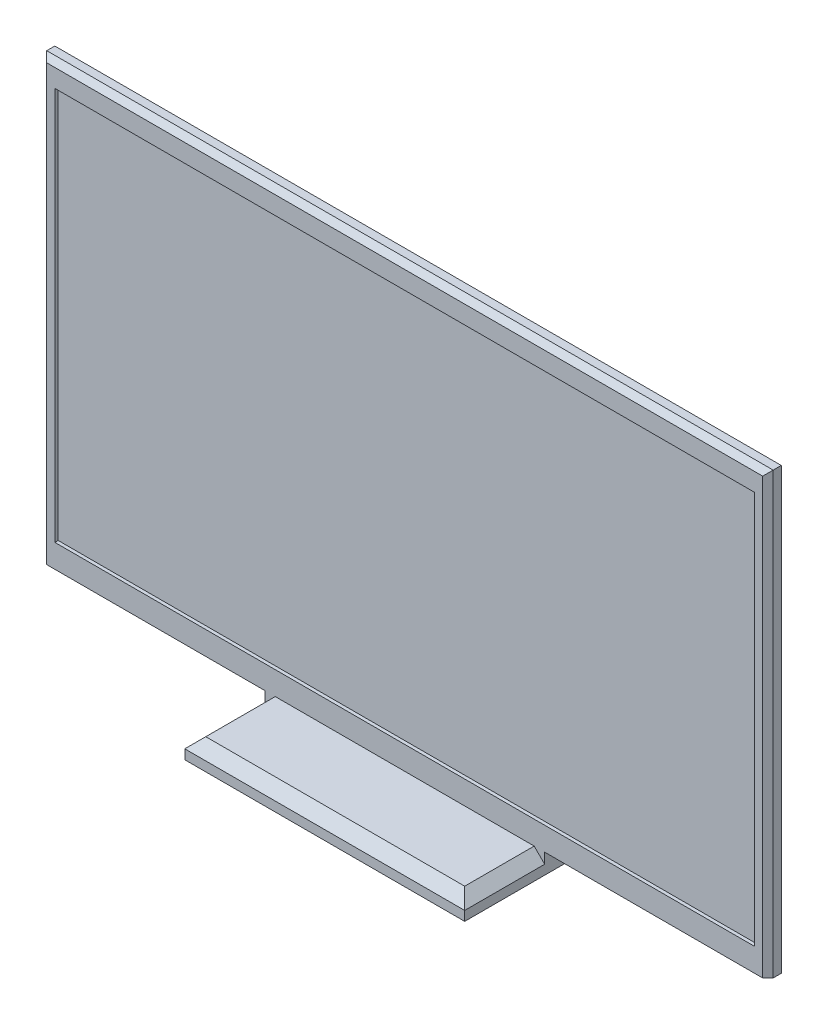
ISO-10303-21;
HEADER;
FILE_DESCRIPTION(('STEP AP214'),'2;1');
FILE_NAME('part.step','',(''),(''),'','','');
FILE_SCHEMA(('AUTOMOTIVE_DESIGN { 1 0 10303 214 1 1 1 1 }'));
ENDSEC;
DATA;
#1=APPLICATION_CONTEXT('core data for automotive mechanical design processes');
#2=APPLICATION_PROTOCOL_DEFINITION('international standard','automotive_design',2000,#1);
#3=PRODUCT_CONTEXT('',#1,'mechanical');
#4=PRODUCT('Part','Part','',(#3));
#5=PRODUCT_RELATED_PRODUCT_CATEGORY('part','',(#4));
#6=PRODUCT_DEFINITION_FORMATION('','',#4);
#7=PRODUCT_DEFINITION_CONTEXT('part definition',#1,'design');
#8=PRODUCT_DEFINITION('design','',#6,#7);
#9=PRODUCT_DEFINITION_SHAPE('','',#8);
#10=(LENGTH_UNIT() NAMED_UNIT(*) SI_UNIT(.MILLI.,.METRE.));
#11=(NAMED_UNIT(*) PLANE_ANGLE_UNIT() SI_UNIT($,.RADIAN.));
#12=(NAMED_UNIT(*) SI_UNIT($,.STERADIAN.) SOLID_ANGLE_UNIT());
#13=UNCERTAINTY_MEASURE_WITH_UNIT(LENGTH_MEASURE(1.E-05),#10,'distance_accuracy_value','');
#14=(GEOMETRIC_REPRESENTATION_CONTEXT(3) GLOBAL_UNCERTAINTY_ASSIGNED_CONTEXT((#13)) GLOBAL_UNIT_ASSIGNED_CONTEXT((#10,
#11,#12)) REPRESENTATION_CONTEXT('',''));
#15=CARTESIAN_POINT('',(0.,0.,0.));
#16=DIRECTION('',(0.,0.,1.));
#17=DIRECTION('',(1.,0.,0.));
#18=AXIS2_PLACEMENT_3D('',#15,#16,#17);
#19=CARTESIAN_POINT('',(-692.15,-419.1,25.4000000000003));
#20=DIRECTION('',(0.,1.,0.));
#21=DIRECTION('',(0.,0.,1.));
#22=AXIS2_PLACEMENT_3D('',#19,#20,#21);
#23=PLANE('',#22);
#24=DIRECTION('',(0.,0.,-1.));
#25=VECTOR('',#24,1.);
#26=CARTESIAN_POINT('',(-266.699999999999,-419.1,-152.4));
#27=LINE('',#26,#25);
#28=CARTESIAN_POINT('',(-266.7,-419.1,25.4000000000003));
#29=VERTEX_POINT('',#28);
#30=CARTESIAN_POINT('',(-266.7,-419.1,0.));
#31=VERTEX_POINT('',#30);
#32=EDGE_CURVE('E289',#29,#31,#27,.T.);
#33=ORIENTED_EDGE('',*,*,#32,.F.);
#34=DIRECTION('',(1.,0.,0.));
#35=VECTOR('',#34,1.);
#36=CARTESIAN_POINT('',(-692.15,-419.1,25.4000000000003));
#37=LINE('',#36,#35);
#38=CARTESIAN_POINT('',(-682.15,-419.1,25.3999999999994));
#39=VERTEX_POINT('',#38);
#40=EDGE_CURVE('E231',#39,#29,#37,.T.);
#41=ORIENTED_EDGE('',*,*,#40,.F.);
#42=DIRECTION('',(0.707106781186547,0.,0.707106781186547));
#43=VECTOR('',#42,1.);
#44=CARTESIAN_POINT('',(-682.15,-419.1,25.3999999999994));
#45=LINE('',#44,#43);
#46=CARTESIAN_POINT('',(-692.15,-419.1,15.4000000000005));
#47=VERTEX_POINT('',#46);
#48=EDGE_CURVE('E273',#39,#47,#45,.F.);
#49=ORIENTED_EDGE('',*,*,#48,.T.);
#50=DIRECTION('',(0.,0.,-1.));
#51=VECTOR('',#50,1.);
#52=CARTESIAN_POINT('',(-692.15,-419.1,25.4000000000003));
#53=LINE('',#52,#51);
#54=CARTESIAN_POINT('',(-692.15,-419.1,0.));
#55=VERTEX_POINT('',#54);
#56=EDGE_CURVE('E253',#47,#55,#53,.T.);
#57=ORIENTED_EDGE('',*,*,#56,.T.);
#58=DIRECTION('',(1.,0.,0.));
#59=VECTOR('',#58,1.);
#60=CARTESIAN_POINT('',(-692.15,-419.1,0.));
#61=LINE('',#60,#59);
#62=EDGE_CURVE('E247',#55,#31,#61,.T.);
#63=ORIENTED_EDGE('',*,*,#62,.T.);
#64=EDGE_LOOP('',(#33,#41,#49,#57,#63));
#65=FACE_BOUND('',#64,.T.);
#66=ADVANCED_FACE('F36',(#65),#23,.F.);
#67=DIRECTION('',(0.,0.,1.));
#68=VECTOR('',#67,1.);
#69=CARTESIAN_POINT('',(266.7,-419.1,-152.4));
#70=LINE('',#69,#68);
#71=CARTESIAN_POINT('',(266.7,-419.1,0.));
#72=VERTEX_POINT('',#71);
#73=CARTESIAN_POINT('',(266.7,-419.1,25.3999999999994));
#74=VERTEX_POINT('',#73);
#75=EDGE_CURVE('E284',#72,#74,#70,.T.);
#76=ORIENTED_EDGE('',*,*,#75,.F.);
#77=CARTESIAN_POINT('',(692.15,-419.1,0.));
#78=VERTEX_POINT('',#77);
#79=EDGE_CURVE('E246',#72,#78,#61,.T.);
#80=ORIENTED_EDGE('',*,*,#79,.T.);
#81=DIRECTION('',(0.,0.,-1.));
#82=VECTOR('',#81,1.);
#83=CARTESIAN_POINT('',(692.15,-419.1,25.4000000000003));
#84=LINE('',#83,#82);
#85=CARTESIAN_POINT('',(692.15,-419.1,15.3999999999996));
#86=VERTEX_POINT('',#85);
#87=EDGE_CURVE('E234',#86,#78,#84,.T.);
#88=ORIENTED_EDGE('',*,*,#87,.F.);
#89=DIRECTION('',(0.707106781186547,0.,-0.707106781186547));
#90=VECTOR('',#89,1.);
#91=CARTESIAN_POINT('',(682.15,-419.1,25.4000000000003));
#92=LINE('',#91,#90);
#93=CARTESIAN_POINT('',(682.149999999999,-419.1,25.4000000000003));
#94=VERTEX_POINT('',#93);
#95=EDGE_CURVE('E270',#86,#94,#92,.F.);
#96=ORIENTED_EDGE('',*,*,#95,.T.);
#97=EDGE_CURVE('E236',#74,#94,#37,.T.);
#98=ORIENTED_EDGE('',*,*,#97,.F.);
#99=EDGE_LOOP('',(#76,#80,#88,#96,#98));
#100=FACE_BOUND('',#99,.T.);
#101=ADVANCED_FACE('F334',(#100),#23,.F.);
#102=CARTESIAN_POINT('',(692.15,-419.1,25.4000000000003));
#103=DIRECTION('',(-1.,0.,0.));
#104=DIRECTION('',(0.,0.,1.));
#105=AXIS2_PLACEMENT_3D('',#102,#103,#104);
#106=PLANE('',#105);
#107=DIRECTION('',(0.,0.,-1.));
#108=VECTOR('',#107,1.);
#109=CARTESIAN_POINT('',(692.150000000001,419.1,25.4000000000003));
#110=LINE('',#109,#108);
#111=CARTESIAN_POINT('',(692.150000000001,419.1,15.4000000000005));
#112=VERTEX_POINT('',#111);
#113=CARTESIAN_POINT('',(692.150000000001,419.1,8.88178419700125E-13));
#114=VERTEX_POINT('',#113);
#115=EDGE_CURVE('E259',#112,#114,#110,.T.);
#116=ORIENTED_EDGE('',*,*,#115,.F.);
#117=DIRECTION('',(0.,-1.,0.));
#118=VECTOR('',#117,1.);
#119=CARTESIAN_POINT('',(692.15,-419.1,15.3999999999996));
#120=LINE('',#119,#118);
#121=EDGE_CURVE('E279',#112,#86,#120,.T.);
#122=ORIENTED_EDGE('',*,*,#121,.T.);
#123=ORIENTED_EDGE('',*,*,#87,.T.);
#124=DIRECTION('',(0.,1.,0.));
#125=VECTOR('',#124,1.);
#126=CARTESIAN_POINT('',(692.15,-419.1,0.));
#127=LINE('',#126,#125);
#128=EDGE_CURVE('E237',#78,#114,#127,.T.);
#129=ORIENTED_EDGE('',*,*,#128,.T.);
#130=EDGE_LOOP('',(#116,#122,#123,#129));
#131=FACE_BOUND('',#130,.T.);
#132=ADVANCED_FACE('F371',(#131),#106,.F.);
#133=CARTESIAN_POINT('',(-692.149999999999,419.1,25.3999999999994));
#134=DIRECTION('',(0.,-1.,0.));
#135=DIRECTION('',(0.,0.,-1.));
#136=AXIS2_PLACEMENT_3D('',#133,#134,#135);
#137=PLANE('',#136);
#138=DIRECTION('',(0.,0.,-1.));
#139=VECTOR('',#138,1.);
#140=CARTESIAN_POINT('',(-692.149999999999,419.1,25.3999999999994));
#141=LINE('',#140,#139);
#142=CARTESIAN_POINT('',(-692.149999999999,419.1,15.3999999999996));
#143=VERTEX_POINT('',#142);
#144=CARTESIAN_POINT('',(-692.149999999999,419.1,0.));
#145=VERTEX_POINT('',#144);
#146=EDGE_CURVE('E256',#143,#145,#141,.T.);
#147=ORIENTED_EDGE('',*,*,#146,.F.);
#148=DIRECTION('',(1.,0.,0.));
#149=VECTOR('',#148,1.);
#150=CARTESIAN_POINT('',(-692.149999999999,419.1,15.3999999999996));
#151=LINE('',#150,#149);
#152=EDGE_CURVE('E281',#143,#112,#151,.T.);
#153=ORIENTED_EDGE('',*,*,#152,.T.);
#154=ORIENTED_EDGE('',*,*,#115,.T.);
#155=DIRECTION('',(-1.,0.,0.));
#156=VECTOR('',#155,1.);
#157=CARTESIAN_POINT('',(-692.149999999999,419.1,0.));
#158=LINE('',#157,#156);
#159=EDGE_CURVE('E240',#114,#145,#158,.T.);
#160=ORIENTED_EDGE('',*,*,#159,.T.);
#161=EDGE_LOOP('',(#147,#153,#154,#160));
#162=FACE_BOUND('',#161,.T.);
#163=ADVANCED_FACE('F359',(#162),#137,.F.);
#164=CARTESIAN_POINT('',(-692.15,-419.1,25.4000000000003));
#165=DIRECTION('',(1.,0.,0.));
#166=DIRECTION('',(0.,0.,-1.));
#167=AXIS2_PLACEMENT_3D('',#164,#165,#166);
#168=PLANE('',#167);
#169=ORIENTED_EDGE('',*,*,#56,.F.);
#170=DIRECTION('',(0.,1.,0.));
#171=VECTOR('',#170,1.);
#172=CARTESIAN_POINT('',(-692.15,-419.1,15.4000000000005));
#173=LINE('',#172,#171);
#174=EDGE_CURVE('E276',#47,#143,#173,.T.);
#175=ORIENTED_EDGE('',*,*,#174,.T.);
#176=ORIENTED_EDGE('',*,*,#146,.T.);
#177=DIRECTION('',(0.,-1.,0.));
#178=VECTOR('',#177,1.);
#179=CARTESIAN_POINT('',(-692.15,-419.1,0.));
#180=LINE('',#179,#178);
#181=EDGE_CURVE('E244',#145,#55,#180,.T.);
#182=ORIENTED_EDGE('',*,*,#181,.T.);
#183=EDGE_LOOP('',(#169,#175,#176,#182));
#184=FACE_BOUND('',#183,.T.);
#185=ADVANCED_FACE('F361',(#184),#168,.F.);
#186=CARTESIAN_POINT('',(0.,0.,25.4000000000003));
#187=DIRECTION('',(0.,0.,-1.));
#188=DIRECTION('',(-1.,0.,0.));
#189=AXIS2_PLACEMENT_3D('',#186,#187,#188);
#190=PLANE('',#189);
#191=DIRECTION('',(-1.,0.,0.));
#192=VECTOR('',#191,1.);
#193=CARTESIAN_POINT('',(-666.75,374.65,25.4000000000003));
#194=LINE('',#193,#192);
#195=CARTESIAN_POINT('',(666.75,374.65,25.4000000000003));
#196=VERTEX_POINT('',#195);
#197=CARTESIAN_POINT('',(-666.75,374.65,25.4000000000003));
#198=VERTEX_POINT('',#197);
#199=EDGE_CURVE('E199',#196,#198,#194,.T.);
#200=ORIENTED_EDGE('',*,*,#199,.F.);
#201=DIRECTION('',(0.,1.,0.));
#202=VECTOR('',#201,1.);
#203=CARTESIAN_POINT('',(666.75,-374.65,25.4000000000003));
#204=LINE('',#203,#202);
#205=CARTESIAN_POINT('',(666.75,-374.65,25.4000000000003));
#206=VERTEX_POINT('',#205);
#207=EDGE_CURVE('E196',#206,#196,#204,.T.);
#208=ORIENTED_EDGE('',*,*,#207,.F.);
#209=DIRECTION('',(1.,0.,0.));
#210=VECTOR('',#209,1.);
#211=CARTESIAN_POINT('',(-666.75,-374.65,25.3999999999994));
#212=LINE('',#211,#210);
#213=CARTESIAN_POINT('',(-666.75,-374.65,25.3999999999994));
#214=VERTEX_POINT('',#213);
#215=EDGE_CURVE('E209',#214,#206,#212,.T.);
#216=ORIENTED_EDGE('',*,*,#215,.F.);
#217=DIRECTION('',(0.,-1.,0.));
#218=VECTOR('',#217,1.);
#219=CARTESIAN_POINT('',(-666.75,-374.65,25.3999999999994));
#220=LINE('',#219,#218);
#221=EDGE_CURVE('E218',#198,#214,#220,.T.);
#222=ORIENTED_EDGE('',*,*,#221,.F.);
#223=EDGE_LOOP('',(#200,#208,#216,#222));
#224=FACE_BOUND('',#223,.T.);
#225=DIRECTION('',(-1.,0.,0.));
#226=VECTOR('',#225,1.);
#227=CARTESIAN_POINT('',(8.88178419700125E-13,409.1,25.4000000000003));
#228=LINE('',#227,#226);
#229=CARTESIAN_POINT('',(682.15,409.1,25.4000000000003));
#230=VERTEX_POINT('',#229);
#231=CARTESIAN_POINT('',(-682.149999999999,409.1,25.4000000000003));
#232=VERTEX_POINT('',#231);
#233=EDGE_CURVE('E262',#230,#232,#228,.T.);
#234=ORIENTED_EDGE('',*,*,#233,.T.);
#235=DIRECTION('',(0.,-1.,0.));
#236=VECTOR('',#235,1.);
#237=CARTESIAN_POINT('',(-682.15,0.,25.4000000000003));
#238=LINE('',#237,#236);
#239=EDGE_CURVE('E268',#232,#39,#238,.T.);
#240=ORIENTED_EDGE('',*,*,#239,.T.);
#241=ORIENTED_EDGE('',*,*,#40,.T.);
#242=DIRECTION('',(0.,1.,0.));
#243=VECTOR('',#242,1.);
#244=CARTESIAN_POINT('',(-266.7,-457.2,25.4000000000003));
#245=LINE('',#244,#243);
#246=CARTESIAN_POINT('',(-266.7,-439.1,25.4000000000003));
#247=VERTEX_POINT('',#246);
#248=EDGE_CURVE('E300',#247,#29,#245,.T.);
#249=ORIENTED_EDGE('',*,*,#248,.F.);
#250=DIRECTION('',(0.707106781186547,0.707106781186548,0.));
#251=VECTOR('',#250,1.);
#252=CARTESIAN_POINT('',(86.1999999999998,-86.1999999999996,25.3999999999994));
#253=LINE('',#252,#251);
#254=CARTESIAN_POINT('',(-246.700000000001,-419.1,25.4000000000003));
#255=VERTEX_POINT('',#254);
#256=EDGE_CURVE('E11',#247,#255,#253,.T.);
#257=ORIENTED_EDGE('',*,*,#256,.T.);
#258=CARTESIAN_POINT('',(246.700000000001,-419.1,25.4000000000003));
#259=VERTEX_POINT('',#258);
#260=EDGE_CURVE('E235',#255,#259,#37,.T.);
#261=ORIENTED_EDGE('',*,*,#260,.T.);
#262=DIRECTION('',(0.707106781186547,-0.707106781186547,0.));
#263=VECTOR('',#262,1.);
#264=CARTESIAN_POINT('',(-86.1999999999998,-86.1999999999999,25.4000000000003));
#265=LINE('',#264,#263);
#266=CARTESIAN_POINT('',(266.7,-439.1,25.3999999999994));
#267=VERTEX_POINT('',#266);
#268=EDGE_CURVE('E45',#259,#267,#265,.T.);
#269=ORIENTED_EDGE('',*,*,#268,.T.);
#270=DIRECTION('',(0.,-1.,0.));
#271=VECTOR('',#270,1.);
#272=CARTESIAN_POINT('',(266.7,-457.2,25.3999999999994));
#273=LINE('',#272,#271);
#274=EDGE_CURVE('E53',#74,#267,#273,.T.);
#275=ORIENTED_EDGE('',*,*,#274,.F.);
#276=ORIENTED_EDGE('',*,*,#97,.T.);
#277=DIRECTION('',(0.,1.,0.));
#278=VECTOR('',#277,1.);
#279=CARTESIAN_POINT('',(682.149999999999,0.,25.3999999999994));
#280=LINE('',#279,#278);
#281=EDGE_CURVE('E265',#94,#230,#280,.T.);
#282=ORIENTED_EDGE('',*,*,#281,.T.);
#283=EDGE_LOOP('',(#234,#240,#241,#249,#257,#261,#269,#275,#276,#282));
#284=FACE_BOUND('',#283,.T.);
#285=ADVANCED_FACE('F338',(#224,#284),#190,.F.);
#286=CARTESIAN_POINT('',(0.,0.,0.));
#287=DIRECTION('',(0.,0.,-1.));
#288=DIRECTION('',(-1.,0.,0.));
#289=AXIS2_PLACEMENT_3D('',#286,#287,#288);
#290=PLANE('',#289);
#291=ORIENTED_EDGE('',*,*,#128,.F.);
#292=ORIENTED_EDGE('',*,*,#79,.F.);
#293=EDGE_CURVE('E250',#31,#72,#61,.T.);
#294=ORIENTED_EDGE('',*,*,#293,.F.);
#295=ORIENTED_EDGE('',*,*,#62,.F.);
#296=ORIENTED_EDGE('',*,*,#181,.F.);
#297=ORIENTED_EDGE('',*,*,#159,.F.);
#298=EDGE_LOOP('',(#291,#292,#294,#295,#296,#297));
#299=FACE_BOUND('',#298,.T.);
#300=ADVANCED_FACE('F331',(#299),#290,.T.);
#301=CARTESIAN_POINT('',(682.149999999999,0.,25.3999999999994));
#302=DIRECTION('',(-0.707106781186547,0.,-0.707106781186547));
#303=DIRECTION('',(0.,1.,0.));
#304=AXIS2_PLACEMENT_3D('',#301,#302,#303);
#305=PLANE('',#304);
#306=ORIENTED_EDGE('',*,*,#95,.F.);
#307=ORIENTED_EDGE('',*,*,#121,.F.);
#308=DIRECTION('',(0.577350269189626,0.577350269189626,-0.577350269189625));
#309=VECTOR('',#308,1.);
#310=CARTESIAN_POINT('',(454.766666666666,181.716666666667,252.783333333333));
#311=LINE('',#310,#309);
#312=EDGE_CURVE('E241',#230,#112,#311,.T.);
#313=ORIENTED_EDGE('',*,*,#312,.F.);
#314=ORIENTED_EDGE('',*,*,#281,.F.);
#315=EDGE_LOOP('',(#306,#307,#313,#314));
#316=FACE_BOUND('',#315,.T.);
#317=ADVANCED_FACE('F369',(#316),#305,.F.);
#318=CARTESIAN_POINT('',(8.88178419700125E-13,409.1,25.4000000000003));
#319=DIRECTION('',(0.,-0.707106781186548,-0.707106781186547));
#320=DIRECTION('',(-1.,0.,0.));
#321=AXIS2_PLACEMENT_3D('',#318,#319,#320);
#322=PLANE('',#321);
#323=ORIENTED_EDGE('',*,*,#312,.T.);
#324=ORIENTED_EDGE('',*,*,#152,.F.);
#325=DIRECTION('',(0.577350269189626,-0.577350269189626,0.577350269189625));
#326=VECTOR('',#325,1.);
#327=CARTESIAN_POINT('',(-454.766666666666,181.716666666667,252.783333333333));
#328=LINE('',#327,#326);
#329=EDGE_CURVE('E225',#232,#143,#328,.F.);
#330=ORIENTED_EDGE('',*,*,#329,.F.);
#331=ORIENTED_EDGE('',*,*,#233,.F.);
#332=EDGE_LOOP('',(#323,#324,#330,#331));
#333=FACE_BOUND('',#332,.T.);
#334=ADVANCED_FACE('F365',(#333),#322,.F.);
#335=CARTESIAN_POINT('',(-682.15,0.,25.4000000000003));
#336=DIRECTION('',(0.707106781186547,0.,-0.707106781186547));
#337=DIRECTION('',(0.,-1.,0.));
#338=AXIS2_PLACEMENT_3D('',#335,#336,#337);
#339=PLANE('',#338);
#340=ORIENTED_EDGE('',*,*,#329,.T.);
#341=ORIENTED_EDGE('',*,*,#174,.F.);
#342=ORIENTED_EDGE('',*,*,#48,.F.);
#343=ORIENTED_EDGE('',*,*,#239,.F.);
#344=EDGE_LOOP('',(#340,#341,#342,#343));
#345=FACE_BOUND('',#344,.T.);
#346=ADVANCED_FACE('F401',(#345),#339,.F.);
#347=CARTESIAN_POINT('',(666.75,-374.65,19.05));
#348=DIRECTION('',(1.,0.,0.));
#349=DIRECTION('',(0.,0.,-1.));
#350=AXIS2_PLACEMENT_3D('',#347,#348,#349);
#351=PLANE('',#350);
#352=ORIENTED_EDGE('',*,*,#207,.T.);
#353=DIRECTION('',(0.,0.,1.));
#354=VECTOR('',#353,1.);
#355=CARTESIAN_POINT('',(666.75,374.65,19.05));
#356=LINE('',#355,#354);
#357=CARTESIAN_POINT('',(666.75,374.65,19.05));
#358=VERTEX_POINT('',#357);
#359=EDGE_CURVE('E214',#358,#196,#356,.T.);
#360=ORIENTED_EDGE('',*,*,#359,.F.);
#361=DIRECTION('',(0.,1.,0.));
#362=VECTOR('',#361,1.);
#363=CARTESIAN_POINT('',(666.75,-374.65,19.05));
#364=LINE('',#363,#362);
#365=CARTESIAN_POINT('',(666.75,-374.65,19.05));
#366=VERTEX_POINT('',#365);
#367=EDGE_CURVE('E205',#366,#358,#364,.T.);
#368=ORIENTED_EDGE('',*,*,#367,.F.);
#369=DIRECTION('',(0.,0.,1.));
#370=VECTOR('',#369,1.);
#371=CARTESIAN_POINT('',(666.75,-374.65,19.05));
#372=LINE('',#371,#370);
#373=EDGE_CURVE('E223',#366,#206,#372,.T.);
#374=ORIENTED_EDGE('',*,*,#373,.T.);
#375=EDGE_LOOP('',(#352,#360,#368,#374));
#376=FACE_BOUND('',#375,.T.);
#377=ADVANCED_FACE('F397',(#376),#351,.F.);
#378=CARTESIAN_POINT('',(-666.75,-374.65,19.05));
#379=DIRECTION('',(0.,-1.,0.));
#380=DIRECTION('',(0.,0.,-1.));
#381=AXIS2_PLACEMENT_3D('',#378,#379,#380);
#382=PLANE('',#381);
#383=ORIENTED_EDGE('',*,*,#215,.T.);
#384=ORIENTED_EDGE('',*,*,#373,.F.);
#385=DIRECTION('',(1.,0.,0.));
#386=VECTOR('',#385,1.);
#387=CARTESIAN_POINT('',(-666.75,-374.65,19.05));
#388=LINE('',#387,#386);
#389=CARTESIAN_POINT('',(-666.75,-374.65,19.05));
#390=VERTEX_POINT('',#389);
#391=EDGE_CURVE('E213',#390,#366,#388,.T.);
#392=ORIENTED_EDGE('',*,*,#391,.F.);
#393=DIRECTION('',(0.,0.,1.));
#394=VECTOR('',#393,1.);
#395=CARTESIAN_POINT('',(-666.75,-374.65,19.05));
#396=LINE('',#395,#394);
#397=EDGE_CURVE('E226',#390,#214,#396,.T.);
#398=ORIENTED_EDGE('',*,*,#397,.T.);
#399=EDGE_LOOP('',(#383,#384,#392,#398));
#400=FACE_BOUND('',#399,.T.);
#401=ADVANCED_FACE('F400',(#400),#382,.F.);
#402=CARTESIAN_POINT('',(-666.75,-374.65,19.05));
#403=DIRECTION('',(-1.,0.,0.));
#404=DIRECTION('',(0.,0.,1.));
#405=AXIS2_PLACEMENT_3D('',#402,#403,#404);
#406=PLANE('',#405);
#407=ORIENTED_EDGE('',*,*,#221,.T.);
#408=ORIENTED_EDGE('',*,*,#397,.F.);
#409=DIRECTION('',(0.,-1.,0.));
#410=VECTOR('',#409,1.);
#411=CARTESIAN_POINT('',(-666.75,-374.65,19.05));
#412=LINE('',#411,#410);
#413=CARTESIAN_POINT('',(-666.749999999999,374.65,19.05));
#414=VERTEX_POINT('',#413);
#415=EDGE_CURVE('E211',#414,#390,#412,.T.);
#416=ORIENTED_EDGE('',*,*,#415,.F.);
#417=DIRECTION('',(0.,0.,1.));
#418=VECTOR('',#417,1.);
#419=CARTESIAN_POINT('',(-666.749999999999,374.65,19.05));
#420=LINE('',#419,#418);
#421=EDGE_CURVE('E228',#414,#198,#420,.T.);
#422=ORIENTED_EDGE('',*,*,#421,.T.);
#423=EDGE_LOOP('',(#407,#408,#416,#422));
#424=FACE_BOUND('',#423,.T.);
#425=ADVANCED_FACE('F407',(#424),#406,.F.);
#426=CARTESIAN_POINT('',(-666.749999999999,374.65,19.05));
#427=DIRECTION('',(0.,1.,0.));
#428=DIRECTION('',(0.,0.,1.));
#429=AXIS2_PLACEMENT_3D('',#426,#427,#428);
#430=PLANE('',#429);
#431=ORIENTED_EDGE('',*,*,#199,.T.);
#432=ORIENTED_EDGE('',*,*,#421,.F.);
#433=DIRECTION('',(-1.,0.,0.));
#434=VECTOR('',#433,1.);
#435=CARTESIAN_POINT('',(-666.749999999999,374.65,19.05));
#436=LINE('',#435,#434);
#437=EDGE_CURVE('E208',#358,#414,#436,.T.);
#438=ORIENTED_EDGE('',*,*,#437,.F.);
#439=ORIENTED_EDGE('',*,*,#359,.T.);
#440=EDGE_LOOP('',(#431,#432,#438,#439));
#441=FACE_BOUND('',#440,.T.);
#442=ADVANCED_FACE('F403',(#441),#430,.F.);
#443=CARTESIAN_POINT('',(0.,0.,19.05));
#444=DIRECTION('',(0.,0.,-1.));
#445=DIRECTION('',(-1.,0.,0.));
#446=AXIS2_PLACEMENT_3D('',#443,#444,#445);
#447=PLANE('',#446);
#448=ORIENTED_EDGE('',*,*,#367,.T.);
#449=ORIENTED_EDGE('',*,*,#437,.T.);
#450=ORIENTED_EDGE('',*,*,#415,.T.);
#451=ORIENTED_EDGE('',*,*,#391,.T.);
#452=EDGE_LOOP('',(#448,#449,#450,#451));
#453=FACE_BOUND('',#452,.T.);
#454=ADVANCED_FACE('F406',(#453),#447,.F.);
#455=CARTESIAN_POINT('',(0.,-419.1,0.));
#456=DIRECTION('',(0.,1.,0.));
#457=DIRECTION('',(0.,0.,1.));
#458=AXIS2_PLACEMENT_3D('',#455,#456,#457);
#459=PLANE('',#458);
#460=DIRECTION('',(1.,0.,0.));
#461=VECTOR('',#460,1.);
#462=CARTESIAN_POINT('',(266.700000000001,-419.1,157.8));
#463=LINE('',#462,#461);
#464=CARTESIAN_POINT('',(-246.7,-419.1,157.800000000001));
#465=VERTEX_POINT('',#464);
#466=CARTESIAN_POINT('',(246.700000000001,-419.1,157.800000000001));
#467=VERTEX_POINT('',#466);
#468=EDGE_CURVE('E292',#465,#467,#463,.T.);
#469=ORIENTED_EDGE('',*,*,#468,.T.);
#470=DIRECTION('',(0.,0.,-1.));
#471=VECTOR('',#470,1.);
#472=CARTESIAN_POINT('',(246.700000000001,-419.1,25.4000000000003));
#473=LINE('',#472,#471);
#474=EDGE_CURVE('E298',#467,#259,#473,.T.);
#475=ORIENTED_EDGE('',*,*,#474,.T.);
#476=ORIENTED_EDGE('',*,*,#260,.F.);
#477=DIRECTION('',(0.,0.,1.));
#478=VECTOR('',#477,1.);
#479=CARTESIAN_POINT('',(-246.7,-419.1,177.8));
#480=LINE('',#479,#478);
#481=EDGE_CURVE('E295',#255,#465,#480,.T.);
#482=ORIENTED_EDGE('',*,*,#481,.T.);
#483=EDGE_LOOP('',(#469,#475,#476,#482));
#484=FACE_BOUND('',#483,.T.);
#485=ADVANCED_FACE('F342',(#484),#459,.T.);
#486=CARTESIAN_POINT('',(-266.699999999999,-457.2,-152.4));
#487=DIRECTION('',(1.,0.,0.));
#488=DIRECTION('',(0.,0.,-1.));
#489=AXIS2_PLACEMENT_3D('',#486,#487,#488);
#490=PLANE('',#489);
#491=DIRECTION('',(0.,1.,0.));
#492=VECTOR('',#491,1.);
#493=CARTESIAN_POINT('',(-266.699999999999,-457.2,177.8));
#494=LINE('',#493,#492);
#495=CARTESIAN_POINT('',(-266.699999999999,-457.2,177.8));
#496=VERTEX_POINT('',#495);
#497=CARTESIAN_POINT('',(-266.699999999999,-439.1,177.8));
#498=VERTEX_POINT('',#497);
#499=EDGE_CURVE('E347',#496,#498,#494,.T.);
#500=ORIENTED_EDGE('',*,*,#499,.T.);
#501=DIRECTION('',(0.,0.,-1.));
#502=VECTOR('',#501,1.);
#503=CARTESIAN_POINT('',(-266.7,-439.1,25.4000000000003));
#504=LINE('',#503,#502);
#505=EDGE_CURVE('E61',#498,#247,#504,.T.);
#506=ORIENTED_EDGE('',*,*,#505,.T.);
#507=ORIENTED_EDGE('',*,*,#248,.T.);
#508=ORIENTED_EDGE('',*,*,#32,.T.);
#509=CARTESIAN_POINT('',(-266.699999999999,-419.1,-152.4));
#510=VERTEX_POINT('',#509);
#511=EDGE_CURVE('E195',#31,#510,#27,.T.);
#512=ORIENTED_EDGE('',*,*,#511,.T.);
#513=DIRECTION('',(0.,1.,0.));
#514=VECTOR('',#513,1.);
#515=CARTESIAN_POINT('',(-266.699999999999,-457.2,-152.4));
#516=LINE('',#515,#514);
#517=CARTESIAN_POINT('',(-266.699999999999,-457.2,-152.4));
#518=VERTEX_POINT('',#517);
#519=EDGE_CURVE('E178',#518,#510,#516,.T.);
#520=ORIENTED_EDGE('',*,*,#519,.F.);
#521=DIRECTION('',(0.,0.,-1.));
#522=VECTOR('',#521,1.);
#523=CARTESIAN_POINT('',(-266.699999999999,-457.2,-152.4));
#524=LINE('',#523,#522);
#525=EDGE_CURVE('E185',#496,#518,#524,.T.);
#526=ORIENTED_EDGE('',*,*,#525,.F.);
#527=EDGE_LOOP('',(#500,#506,#507,#508,#512,#520,#526));
#528=FACE_BOUND('',#527,.T.);
#529=ADVANCED_FACE('F193',(#528),#490,.F.);
#530=CARTESIAN_POINT('',(-266.699999999999,-457.2,-152.4));
#531=DIRECTION('',(0.,0.,1.));
#532=DIRECTION('',(1.,0.,0.));
#533=AXIS2_PLACEMENT_3D('',#530,#531,#532);
#534=PLANE('',#533);
#535=DIRECTION('',(1.,0.,0.));
#536=VECTOR('',#535,1.);
#537=CARTESIAN_POINT('',(-266.699999999999,-419.1,-152.4));
#538=LINE('',#537,#536);
#539=CARTESIAN_POINT('',(266.7,-419.1,-152.4));
#540=VERTEX_POINT('',#539);
#541=EDGE_CURVE('E312',#510,#540,#538,.T.);
#542=ORIENTED_EDGE('',*,*,#541,.T.);
#543=DIRECTION('',(0.,1.,0.));
#544=VECTOR('',#543,1.);
#545=CARTESIAN_POINT('',(266.7,-457.2,-152.4));
#546=LINE('',#545,#544);
#547=CARTESIAN_POINT('',(266.7,-457.2,-152.4));
#548=VERTEX_POINT('',#547);
#549=EDGE_CURVE('E181',#548,#540,#546,.T.);
#550=ORIENTED_EDGE('',*,*,#549,.F.);
#551=DIRECTION('',(1.,0.,0.));
#552=VECTOR('',#551,1.);
#553=CARTESIAN_POINT('',(-266.699999999999,-457.2,-152.4));
#554=LINE('',#553,#552);
#555=EDGE_CURVE('E173',#518,#548,#554,.T.);
#556=ORIENTED_EDGE('',*,*,#555,.F.);
#557=ORIENTED_EDGE('',*,*,#519,.T.);
#558=EDGE_LOOP('',(#542,#550,#556,#557));
#559=FACE_BOUND('',#558,.T.);
#560=ADVANCED_FACE('F176',(#559),#534,.F.);
#561=CARTESIAN_POINT('',(266.7,-457.2,-152.4));
#562=DIRECTION('',(-1.,0.,0.));
#563=DIRECTION('',(0.,0.,1.));
#564=AXIS2_PLACEMENT_3D('',#561,#562,#563);
#565=PLANE('',#564);
#566=ORIENTED_EDGE('',*,*,#274,.T.);
#567=DIRECTION('',(0.,0.,1.));
#568=VECTOR('',#567,1.);
#569=CARTESIAN_POINT('',(266.7,-439.1,177.799999999999));
#570=LINE('',#569,#568);
#571=CARTESIAN_POINT('',(266.7,-439.1,177.799999999999));
#572=VERTEX_POINT('',#571);
#573=EDGE_CURVE('E288',#267,#572,#570,.T.);
#574=ORIENTED_EDGE('',*,*,#573,.T.);
#575=DIRECTION('',(0.,1.,0.));
#576=VECTOR('',#575,1.);
#577=CARTESIAN_POINT('',(266.7,-457.2,177.799999999999));
#578=LINE('',#577,#576);
#579=CARTESIAN_POINT('',(266.7,-457.2,177.799999999999));
#580=VERTEX_POINT('',#579);
#581=EDGE_CURVE('E201',#580,#572,#578,.T.);
#582=ORIENTED_EDGE('',*,*,#581,.F.);
#583=DIRECTION('',(0.,0.,1.));
#584=VECTOR('',#583,1.);
#585=CARTESIAN_POINT('',(266.7,-457.2,-152.4));
#586=LINE('',#585,#584);
#587=EDGE_CURVE('E184',#548,#580,#586,.T.);
#588=ORIENTED_EDGE('',*,*,#587,.F.);
#589=ORIENTED_EDGE('',*,*,#549,.T.);
#590=EDGE_CURVE('E191',#540,#72,#70,.T.);
#591=ORIENTED_EDGE('',*,*,#590,.T.);
#592=ORIENTED_EDGE('',*,*,#75,.T.);
#593=EDGE_LOOP('',(#566,#574,#582,#588,#589,#591,#592));
#594=FACE_BOUND('',#593,.T.);
#595=ADVANCED_FACE('F323',(#594),#565,.F.);
#596=CARTESIAN_POINT('',(-266.699999999999,-457.2,177.8));
#597=DIRECTION('',(0.,0.,-1.));
#598=DIRECTION('',(-1.,0.,0.));
#599=AXIS2_PLACEMENT_3D('',#596,#597,#598);
#600=PLANE('',#599);
#601=ORIENTED_EDGE('',*,*,#581,.T.);
#602=DIRECTION('',(-1.,0.,0.));
#603=VECTOR('',#602,1.);
#604=CARTESIAN_POINT('',(-266.699999999999,-439.1,177.8));
#605=LINE('',#604,#603);
#606=EDGE_CURVE('E303',#572,#498,#605,.T.);
#607=ORIENTED_EDGE('',*,*,#606,.T.);
#608=ORIENTED_EDGE('',*,*,#499,.F.);
#609=DIRECTION('',(-1.,0.,0.));
#610=VECTOR('',#609,1.);
#611=CARTESIAN_POINT('',(-266.699999999999,-457.2,177.8));
#612=LINE('',#611,#610);
#613=EDGE_CURVE('E189',#580,#496,#612,.T.);
#614=ORIENTED_EDGE('',*,*,#613,.F.);
#615=EDGE_LOOP('',(#601,#607,#608,#614));
#616=FACE_BOUND('',#615,.T.);
#617=ADVANCED_FACE('F349',(#616),#600,.F.);
#618=CARTESIAN_POINT('',(0.,-457.2,0.));
#619=DIRECTION('',(0.,1.,0.));
#620=DIRECTION('',(0.,0.,1.));
#621=AXIS2_PLACEMENT_3D('',#618,#619,#620);
#622=PLANE('',#621);
#623=ORIENTED_EDGE('',*,*,#525,.T.);
#624=ORIENTED_EDGE('',*,*,#555,.T.);
#625=ORIENTED_EDGE('',*,*,#587,.T.);
#626=ORIENTED_EDGE('',*,*,#613,.T.);
#627=EDGE_LOOP('',(#623,#624,#625,#626));
#628=FACE_BOUND('',#627,.T.);
#629=ADVANCED_FACE('F188',(#628),#622,.F.);
#630=ORIENTED_EDGE('',*,*,#511,.F.);
#631=ORIENTED_EDGE('',*,*,#293,.T.);
#632=ORIENTED_EDGE('',*,*,#590,.F.);
#633=ORIENTED_EDGE('',*,*,#541,.F.);
#634=EDGE_LOOP('',(#630,#631,#632,#633));
#635=FACE_BOUND('',#634,.T.);
#636=ADVANCED_FACE('F327',(#635),#459,.T.);
#637=CARTESIAN_POINT('',(-266.699999999999,-439.1,-152.4));
#638=DIRECTION('',(-0.707106781186548,0.707106781186547,0.));
#639=DIRECTION('',(0.,0.,1.));
#640=AXIS2_PLACEMENT_3D('',#637,#638,#639);
#641=PLANE('',#640);
#642=ORIENTED_EDGE('',*,*,#256,.F.);
#643=ORIENTED_EDGE('',*,*,#505,.F.);
#644=DIRECTION('',(-0.577350269189625,-0.577350269189626,0.577350269189626));
#645=VECTOR('',#644,1.);
#646=CARTESIAN_POINT('',(-266.699999999999,-439.1,177.8));
#647=LINE('',#646,#645);
#648=EDGE_CURVE('E40',#465,#498,#647,.T.);
#649=ORIENTED_EDGE('',*,*,#648,.F.);
#650=ORIENTED_EDGE('',*,*,#481,.F.);
#651=EDGE_LOOP('',(#642,#643,#649,#650));
#652=FACE_BOUND('',#651,.T.);
#653=ADVANCED_FACE('F38',(#652),#641,.T.);
#654=CARTESIAN_POINT('',(-266.699999999999,-439.1,177.8));
#655=DIRECTION('',(0.,0.707106781186548,0.707106781186547));
#656=DIRECTION('',(1.,0.,0.));
#657=AXIS2_PLACEMENT_3D('',#654,#655,#656);
#658=PLANE('',#657);
#659=ORIENTED_EDGE('',*,*,#648,.T.);
#660=ORIENTED_EDGE('',*,*,#606,.F.);
#661=DIRECTION('',(-0.577350269189625,0.577350269189626,-0.577350269189626));
#662=VECTOR('',#661,1.);
#663=CARTESIAN_POINT('',(88.8999999999997,-261.3,0.));
#664=LINE('',#663,#662);
#665=EDGE_CURVE('E306',#467,#572,#664,.F.);
#666=ORIENTED_EDGE('',*,*,#665,.F.);
#667=ORIENTED_EDGE('',*,*,#468,.F.);
#668=EDGE_LOOP('',(#659,#660,#666,#667));
#669=FACE_BOUND('',#668,.T.);
#670=ADVANCED_FACE('F443',(#669),#658,.T.);
#671=CARTESIAN_POINT('',(266.7,-439.1,-152.4));
#672=DIRECTION('',(0.707106781186547,0.707106781186548,0.));
#673=DIRECTION('',(0.,0.,-1.));
#674=AXIS2_PLACEMENT_3D('',#671,#672,#673);
#675=PLANE('',#674);
#676=ORIENTED_EDGE('',*,*,#268,.F.);
#677=ORIENTED_EDGE('',*,*,#474,.F.);
#678=ORIENTED_EDGE('',*,*,#665,.T.);
#679=ORIENTED_EDGE('',*,*,#573,.F.);
#680=EDGE_LOOP('',(#676,#677,#678,#679));
#681=FACE_BOUND('',#680,.T.);
#682=ADVANCED_FACE('F343',(#681),#675,.T.);
#683=CLOSED_SHELL('',(#66,#101,#132,#163,#185,#285,#300,#317,#334,#346,#377,#401,#425,#442,#454,
#485,#529,#560,#595,#617,#629,#636,#653,#670,#682));
#684=MANIFOLD_SOLID_BREP('B2',#683);
#685=ADVANCED_BREP_SHAPE_REPRESENTATION('',(#18,#684),#14);
#686=SHAPE_DEFINITION_REPRESENTATION(#9,#685);
ENDSEC;
END-ISO-10303-21;
